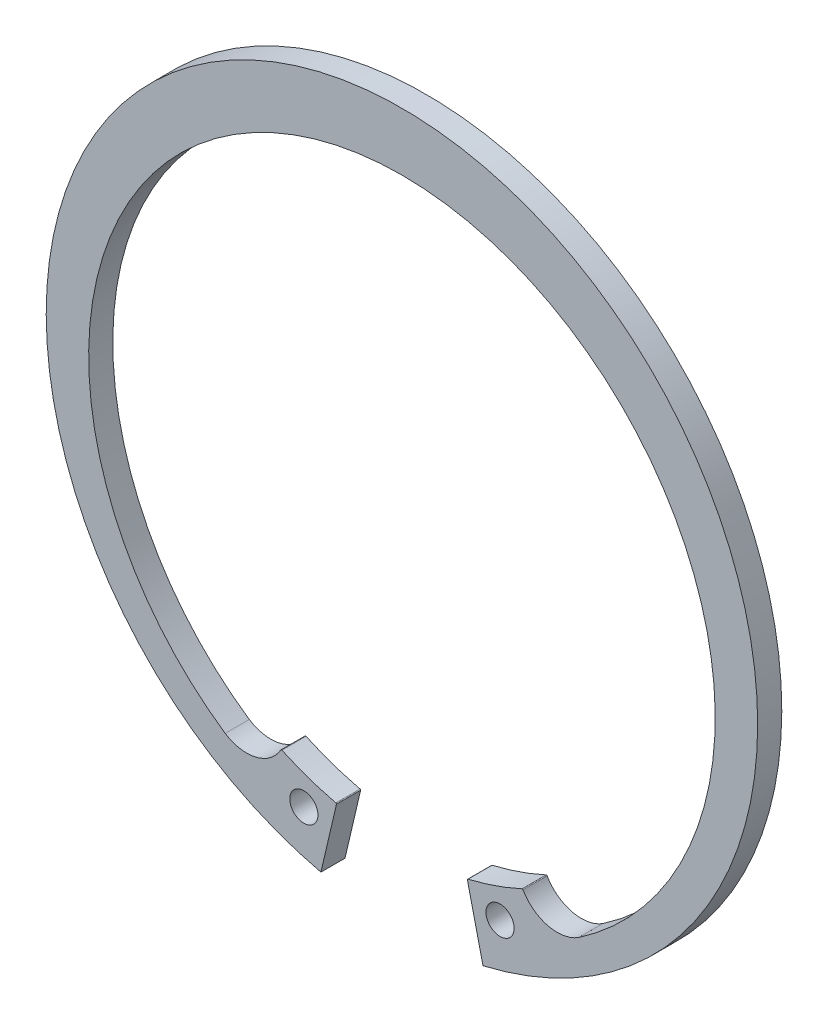
ISO-10303-21;
HEADER;
FILE_DESCRIPTION(('STEP AP214'),'2;1');
FILE_NAME('part.step','',(''),(''),'','','');
FILE_SCHEMA(('AUTOMOTIVE_DESIGN { 1 0 10303 214 1 1 1 1 }'));
ENDSEC;
DATA;
#1=APPLICATION_CONTEXT('core data for automotive mechanical design processes');
#2=APPLICATION_PROTOCOL_DEFINITION('international standard','automotive_design',2000,#1);
#3=PRODUCT_CONTEXT('',#1,'mechanical');
#4=PRODUCT('Part','Part','',(#3));
#5=PRODUCT_RELATED_PRODUCT_CATEGORY('part','',(#4));
#6=PRODUCT_DEFINITION_FORMATION('','',#4);
#7=PRODUCT_DEFINITION_CONTEXT('part definition',#1,'design');
#8=PRODUCT_DEFINITION('design','',#6,#7);
#9=PRODUCT_DEFINITION_SHAPE('','',#8);
#10=(LENGTH_UNIT() NAMED_UNIT(*) SI_UNIT(.MILLI.,.METRE.));
#11=(NAMED_UNIT(*) PLANE_ANGLE_UNIT() SI_UNIT($,.RADIAN.));
#12=(NAMED_UNIT(*) SI_UNIT($,.STERADIAN.) SOLID_ANGLE_UNIT());
#13=UNCERTAINTY_MEASURE_WITH_UNIT(LENGTH_MEASURE(1.E-05),#10,'distance_accuracy_value','');
#14=(GEOMETRIC_REPRESENTATION_CONTEXT(3) GLOBAL_UNCERTAINTY_ASSIGNED_CONTEXT((#13)) GLOBAL_UNIT_ASSIGNED_CONTEXT((#10,
#11,#12)) REPRESENTATION_CONTEXT('',''));
#15=CARTESIAN_POINT('',(0.,0.,0.));
#16=DIRECTION('',(0.,0.,1.));
#17=DIRECTION('',(1.,0.,0.));
#18=AXIS2_PLACEMENT_3D('',#15,#16,#17);
#19=CARTESIAN_POINT('',(0.,0.,-3.));
#20=DIRECTION('',(0.,0.,1.));
#21=DIRECTION('',(1.,0.,0.));
#22=AXIS2_PLACEMENT_3D('',#19,#20,#21);
#23=CYLINDRICAL_SURFACE('',#22,44.25);
#24=CARTESIAN_POINT('',(0.,0.,-3.));
#25=DIRECTION('',(0.,0.,1.));
#26=DIRECTION('',(1.,0.,0.));
#27=AXIS2_PLACEMENT_3D('',#24,#25,#26);
#28=CIRCLE('',#27,44.25);
#29=CARTESIAN_POINT('',(10.0815851585561,-43.0862407351904,-3.));
#30=VERTEX_POINT('',#29);
#31=CARTESIAN_POINT('',(-10.0815851585561,-43.0862407351904,-3.));
#32=VERTEX_POINT('',#31);
#33=EDGE_CURVE('E145',#30,#32,#28,.T.);
#34=ORIENTED_EDGE('',*,*,#33,.T.);
#35=DIRECTION('',(0.,0.,1.));
#36=VECTOR('',#35,1.);
#37=CARTESIAN_POINT('',(-10.0815851585561,-43.0862407351904,-3.));
#38=LINE('',#37,#36);
#39=CARTESIAN_POINT('',(-10.0815851585561,-43.0862407351904,0.));
#40=VERTEX_POINT('',#39);
#41=EDGE_CURVE('E35',#32,#40,#38,.T.);
#42=ORIENTED_EDGE('',*,*,#41,.T.);
#43=CARTESIAN_POINT('',(0.,0.,0.));
#44=DIRECTION('',(0.,0.,1.));
#45=DIRECTION('',(1.,0.,0.));
#46=AXIS2_PLACEMENT_3D('',#43,#44,#45);
#47=CIRCLE('',#46,44.25);
#48=CARTESIAN_POINT('',(10.0815851585561,-43.0862407351904,0.));
#49=VERTEX_POINT('',#48);
#50=EDGE_CURVE('E56',#49,#40,#47,.T.);
#51=ORIENTED_EDGE('',*,*,#50,.F.);
#52=DIRECTION('',(0.,0.,1.));
#53=VECTOR('',#52,1.);
#54=CARTESIAN_POINT('',(10.0815851585561,-43.0862407351904,-3.));
#55=LINE('',#54,#53);
#56=EDGE_CURVE('E11',#30,#49,#55,.T.);
#57=ORIENTED_EDGE('',*,*,#56,.F.);
#58=EDGE_LOOP('',(#34,#42,#51,#57));
#59=FACE_BOUND('',#58,.T.);
#60=ADVANCED_FACE('F32',(#59),#23,.T.);
#61=CARTESIAN_POINT('',(10.0815851585561,-43.0862407351904,-3.));
#62=DIRECTION('',(-0.973700355597523,-0.227832432961721,0.));
#63=DIRECTION('',(0.227832432961721,-0.973700355597523,0.));
#64=AXIS2_PLACEMENT_3D('',#61,#62,#63);
#65=PLANE('',#64);
#66=DIRECTION('',(0.227832432961721,-0.973700355597523,0.));
#67=VECTOR('',#66,1.);
#68=CARTESIAN_POINT('',(10.0815851585561,-43.0862407351904,0.));
#69=LINE('',#68,#67);
#70=CARTESIAN_POINT('',(8.14497761364325,-34.8096515304772,0.));
#71=VERTEX_POINT('',#70);
#72=EDGE_CURVE('E248',#71,#49,#69,.T.);
#73=ORIENTED_EDGE('',*,*,#72,.F.);
#74=DIRECTION('',(0.,0.,1.));
#75=VECTOR('',#74,1.);
#76=CARTESIAN_POINT('',(8.14497761364325,-34.8096515304772,-3.));
#77=LINE('',#76,#75);
#78=CARTESIAN_POINT('',(8.14497761364325,-34.8096515304772,-3.));
#79=VERTEX_POINT('',#78);
#80=EDGE_CURVE('E221',#79,#71,#77,.T.);
#81=ORIENTED_EDGE('',*,*,#80,.F.);
#82=DIRECTION('',(0.227832432961721,-0.973700355597523,0.));
#83=VECTOR('',#82,1.);
#84=CARTESIAN_POINT('',(10.0815851585561,-43.0862407351904,-3.));
#85=LINE('',#84,#83);
#86=EDGE_CURVE('E251',#79,#30,#85,.T.);
#87=ORIENTED_EDGE('',*,*,#86,.T.);
#88=ORIENTED_EDGE('',*,*,#56,.T.);
#89=EDGE_LOOP('',(#73,#81,#87,#88));
#90=FACE_BOUND('',#89,.T.);
#91=ADVANCED_FACE('F264',(#90),#65,.T.);
#92=CARTESIAN_POINT('',(0.,-1.9184583111504,-3.));
#93=DIRECTION('',(0.,0.,1.));
#94=DIRECTION('',(1.,0.,0.));
#95=AXIS2_PLACEMENT_3D('',#92,#93,#94);
#96=CYLINDRICAL_SURFACE('',#95,38.9684583111504);
#97=DIRECTION('',(0.,0.,1.));
#98=VECTOR('',#97,1.);
#99=CARTESIAN_POINT('',(-21.9854923683121,-34.0926540038286,-3.));
#100=LINE('',#99,#98);
#101=CARTESIAN_POINT('',(-21.9854923683121,-34.0926540038286,-3.));
#102=VERTEX_POINT('',#101);
#103=CARTESIAN_POINT('',(-21.9854923683121,-34.0926540038286,0.));
#104=VERTEX_POINT('',#103);
#105=EDGE_CURVE('E186',#102,#104,#100,.T.);
#106=ORIENTED_EDGE('',*,*,#105,.F.);
#107=CARTESIAN_POINT('',(0.,-1.9184583111504,-3.));
#108=DIRECTION('',(0.,0.,-1.));
#109=DIRECTION('',(1.,0.,0.));
#110=AXIS2_PLACEMENT_3D('',#107,#108,#109);
#111=CIRCLE('',#110,38.9684583111504);
#112=CARTESIAN_POINT('',(21.9854923683121,-34.0926540038286,-3.));
#113=VERTEX_POINT('',#112);
#114=EDGE_CURVE('E64',#102,#113,#111,.T.);
#115=ORIENTED_EDGE('',*,*,#114,.T.);
#116=DIRECTION('',(0.,0.,1.));
#117=VECTOR('',#116,1.);
#118=CARTESIAN_POINT('',(21.9854923683121,-34.0926540038286,-3.));
#119=LINE('',#118,#117);
#120=CARTESIAN_POINT('',(21.9854923683121,-34.0926540038286,0.));
#121=VERTEX_POINT('',#120);
#122=EDGE_CURVE('E224',#121,#113,#119,.F.);
#123=ORIENTED_EDGE('',*,*,#122,.F.);
#124=CARTESIAN_POINT('',(0.,-1.9184583111504,0.));
#125=DIRECTION('',(0.,0.,-1.));
#126=DIRECTION('',(1.,0.,0.));
#127=AXIS2_PLACEMENT_3D('',#124,#125,#126);
#128=CIRCLE('',#127,38.9684583111504);
#129=EDGE_CURVE('E257',#104,#121,#128,.T.);
#130=ORIENTED_EDGE('',*,*,#129,.F.);
#131=EDGE_LOOP('',(#106,#115,#123,#130));
#132=FACE_BOUND('',#131,.T.);
#133=ADVANCED_FACE('F286',(#132),#96,.F.);
#134=CARTESIAN_POINT('',(-10.0815851585561,-43.0862407351904,-3.));
#135=DIRECTION('',(0.973700355597523,-0.227832432961721,0.));
#136=DIRECTION('',(0.227832432961721,0.973700355597523,0.));
#137=AXIS2_PLACEMENT_3D('',#134,#135,#136);
#138=PLANE('',#137);
#139=DIRECTION('',(0.227832432961721,0.973700355597523,0.));
#140=VECTOR('',#139,1.);
#141=CARTESIAN_POINT('',(-10.0815851585561,-43.0862407351904,0.));
#142=LINE('',#141,#140);
#143=CARTESIAN_POINT('',(-8.14497761364324,-34.8096515304772,0.));
#144=VERTEX_POINT('',#143);
#145=EDGE_CURVE('E255',#40,#144,#142,.T.);
#146=ORIENTED_EDGE('',*,*,#145,.F.);
#147=ORIENTED_EDGE('',*,*,#41,.F.);
#148=DIRECTION('',(0.227832432961721,0.973700355597523,0.));
#149=VECTOR('',#148,1.);
#150=CARTESIAN_POINT('',(-10.0815851585561,-43.0862407351904,-3.));
#151=LINE('',#150,#149);
#152=CARTESIAN_POINT('',(-8.14497761364324,-34.8096515304772,-3.));
#153=VERTEX_POINT('',#152);
#154=EDGE_CURVE('E137',#32,#153,#151,.T.);
#155=ORIENTED_EDGE('',*,*,#154,.T.);
#156=DIRECTION('',(0.,0.,1.));
#157=VECTOR('',#156,1.);
#158=CARTESIAN_POINT('',(-8.14497761364324,-34.8096515304772,-3.));
#159=LINE('',#158,#157);
#160=EDGE_CURVE('E141',#153,#144,#159,.T.);
#161=ORIENTED_EDGE('',*,*,#160,.T.);
#162=EDGE_LOOP('',(#146,#147,#155,#161));
#163=FACE_BOUND('',#162,.T.);
#164=ADVANCED_FACE('F140',(#163),#138,.T.);
#165=CARTESIAN_POINT('',(0.,0.,-3.));
#166=DIRECTION('',(0.,0.,1.));
#167=DIRECTION('',(1.,0.,0.));
#168=AXIS2_PLACEMENT_3D('',#165,#166,#167);
#169=PLANE('',#168);
#170=ORIENTED_EDGE('',*,*,#114,.F.);
#171=DIRECTION('',(-0.541956834096612,-0.840406324331259,0.));
#172=VECTOR('',#171,1.);
#173=CARTESIAN_POINT('',(-23.9815899087751,-37.1879798516582,-3.));
#174=LINE('',#173,#172);
#175=CARTESIAN_POINT('',(-21.9844067641948,-34.0909705698196,-3.));
#176=VERTEX_POINT('',#175);
#177=EDGE_CURVE('E155',#176,#102,#174,.T.);
#178=ORIENTED_EDGE('',*,*,#177,.F.);
#179=CARTESIAN_POINT('',(-19.3207611355442,-29.9604854624094,-3.));
#180=DIRECTION('',(0.,0.,-1.));
#181=DIRECTION('',(1.,0.,0.));
#182=AXIS2_PLACEMENT_3D('',#179,#180,#181);
#183=CIRCLE('',#182,4.91486675888232);
#184=CARTESIAN_POINT('',(-15.0613610013079,-32.4127141944068,-3.));
#185=VERTEX_POINT('',#184);
#186=EDGE_CURVE('E172',#185,#176,#183,.T.);
#187=ORIENTED_EDGE('',*,*,#186,.F.);
#188=CARTESIAN_POINT('',(-14.9746974081079,-32.462608298404,-3.));
#189=DIRECTION('',(0.,0.,1.));
#190=DIRECTION('',(1.,0.,0.));
#191=AXIS2_PLACEMENT_3D('',#188,#189,#190);
#192=CIRCLE('',#191,0.100000000000009);
#193=CARTESIAN_POINT('',(-14.9328101426307,-32.3718037996672,-3.));
#194=VERTEX_POINT('',#193);
#195=EDGE_CURVE('E164',#194,#185,#192,.T.);
#196=ORIENTED_EDGE('',*,*,#195,.F.);
#197=CARTESIAN_POINT('',(0.,0.,-3.));
#198=DIRECTION('',(0.,0.,-1.));
#199=DIRECTION('',(1.,0.,0.));
#200=AXIS2_PLACEMENT_3D('',#197,#198,#199);
#201=CIRCLE('',#200,35.65);
#202=CARTESIAN_POINT('',(-8.21929213130313,-34.6895623619021,-3.));
#203=VERTEX_POINT('',#202);
#204=EDGE_CURVE('E160',#203,#194,#201,.T.);
#205=ORIENTED_EDGE('',*,*,#204,.F.);
#206=CARTESIAN_POINT('',(-8.242347649203,-34.786868287181,-3.));
#207=DIRECTION('',(0.,0.,1.));
#208=DIRECTION('',(-1.,0.,0.));
#209=AXIS2_PLACEMENT_3D('',#206,#207,#208);
#210=CIRCLE('',#209,0.1);
#211=EDGE_CURVE('E151',#153,#203,#210,.T.);
#212=ORIENTED_EDGE('',*,*,#211,.F.);
#213=ORIENTED_EDGE('',*,*,#154,.F.);
#214=ORIENTED_EDGE('',*,*,#33,.F.);
#215=ORIENTED_EDGE('',*,*,#86,.F.);
#216=CARTESIAN_POINT('',(8.24234764920299,-34.786868287181,-3.));
#217=DIRECTION('',(0.,0.,1.));
#218=DIRECTION('',(1.,0.,0.));
#219=AXIS2_PLACEMENT_3D('',#216,#217,#218);
#220=CIRCLE('',#219,0.0999999999999956);
#221=CARTESIAN_POINT('',(8.21929213130313,-34.6895623619022,-3.));
#222=VERTEX_POINT('',#221);
#223=EDGE_CURVE('E206',#222,#79,#220,.T.);
#224=ORIENTED_EDGE('',*,*,#223,.F.);
#225=CARTESIAN_POINT('',(0.,0.,-3.));
#226=DIRECTION('',(0.,0.,-1.));
#227=DIRECTION('',(1.,0.,0.));
#228=AXIS2_PLACEMENT_3D('',#225,#226,#227);
#229=CIRCLE('',#228,35.65);
#230=CARTESIAN_POINT('',(14.9328101426307,-32.3718037996672,-3.));
#231=VERTEX_POINT('',#230);
#232=EDGE_CURVE('E204',#231,#222,#229,.T.);
#233=ORIENTED_EDGE('',*,*,#232,.F.);
#234=CARTESIAN_POINT('',(14.9746974081079,-32.462608298404,-3.));
#235=DIRECTION('',(0.,0.,1.));
#236=DIRECTION('',(-1.,0.,0.));
#237=AXIS2_PLACEMENT_3D('',#234,#235,#236);
#238=CIRCLE('',#237,0.100000000000009);
#239=CARTESIAN_POINT('',(15.0613610013079,-32.4127141944068,-3.));
#240=VERTEX_POINT('',#239);
#241=EDGE_CURVE('E201',#240,#231,#238,.T.);
#242=ORIENTED_EDGE('',*,*,#241,.F.);
#243=CARTESIAN_POINT('',(19.3207611355442,-29.9604854624094,-3.));
#244=DIRECTION('',(0.,0.,-1.));
#245=DIRECTION('',(1.,0.,0.));
#246=AXIS2_PLACEMENT_3D('',#243,#244,#245);
#247=CIRCLE('',#246,4.91486675888232);
#248=CARTESIAN_POINT('',(21.9844067641948,-34.0909705698196,-3.));
#249=VERTEX_POINT('',#248);
#250=EDGE_CURVE('E197',#249,#240,#247,.T.);
#251=ORIENTED_EDGE('',*,*,#250,.F.);
#252=DIRECTION('',(-0.541956834096613,0.840406324331258,0.));
#253=VECTOR('',#252,1.);
#254=CARTESIAN_POINT('',(21.9844067641948,-34.0909705698196,-3.));
#255=LINE('',#254,#253);
#256=EDGE_CURVE('E195',#113,#249,#255,.T.);
#257=ORIENTED_EDGE('',*,*,#256,.F.);
#258=EDGE_LOOP('',(#170,#178,#187,#196,#205,#212,#213,#214,#215,#224,#233,#242,#251,#257));
#259=FACE_BOUND('',#258,.T.);
#260=CARTESIAN_POINT('',(12.2032115447071,-37.120577217968,-3.));
#261=DIRECTION('',(0.,0.,1.));
#262=DIRECTION('',(1.,0.,0.));
#263=AXIS2_PLACEMENT_3D('',#260,#261,#262);
#264=CIRCLE('',#263,1.75);
#265=CARTESIAN_POINT('',(13.9532115447071,-37.120577217968,-3.));
#266=VERTEX_POINT('',#265);
#267=EDGE_CURVE('E243',#266,#266,#264,.T.);
#268=ORIENTED_EDGE('',*,*,#267,.T.);
#269=EDGE_LOOP('',(#268));
#270=FACE_BOUND('',#269,.T.);
#271=CARTESIAN_POINT('',(-12.2032115447071,-37.120577217968,-3.));
#272=DIRECTION('',(0.,0.,1.));
#273=DIRECTION('',(1.,0.,0.));
#274=AXIS2_PLACEMENT_3D('',#271,#272,#273);
#275=CIRCLE('',#274,1.75);
#276=CARTESIAN_POINT('',(-10.4532115447071,-37.120577217968,-3.));
#277=VERTEX_POINT('',#276);
#278=EDGE_CURVE('E237',#277,#277,#275,.T.);
#279=ORIENTED_EDGE('',*,*,#278,.T.);
#280=EDGE_LOOP('',(#279));
#281=FACE_BOUND('',#280,.T.);
#282=ADVANCED_FACE('F157',(#259,#270,#281),#169,.F.);
#283=CARTESIAN_POINT('',(0.,0.,0.));
#284=DIRECTION('',(0.,0.,1.));
#285=DIRECTION('',(1.,0.,0.));
#286=AXIS2_PLACEMENT_3D('',#283,#284,#285);
#287=PLANE('',#286);
#288=DIRECTION('',(-0.541956834096612,-0.840406324331259,0.));
#289=VECTOR('',#288,1.);
#290=CARTESIAN_POINT('',(-23.9815899087751,-37.1879798516582,0.));
#291=LINE('',#290,#289);
#292=CARTESIAN_POINT('',(-21.9844067641948,-34.0909705698196,0.));
#293=VERTEX_POINT('',#292);
#294=EDGE_CURVE('E162',#293,#104,#291,.T.);
#295=ORIENTED_EDGE('',*,*,#294,.T.);
#296=ORIENTED_EDGE('',*,*,#129,.T.);
#297=DIRECTION('',(-0.541956834096613,0.840406324331258,0.));
#298=VECTOR('',#297,1.);
#299=CARTESIAN_POINT('',(21.9844067641948,-34.0909705698196,0.));
#300=LINE('',#299,#298);
#301=CARTESIAN_POINT('',(21.9844067641948,-34.0909705698196,0.));
#302=VERTEX_POINT('',#301);
#303=EDGE_CURVE('E194',#121,#302,#300,.T.);
#304=ORIENTED_EDGE('',*,*,#303,.T.);
#305=CARTESIAN_POINT('',(19.3207611355442,-29.9604854624094,0.));
#306=DIRECTION('',(0.,0.,-1.));
#307=DIRECTION('',(1.,0.,0.));
#308=AXIS2_PLACEMENT_3D('',#305,#306,#307);
#309=CIRCLE('',#308,4.91486675888232);
#310=CARTESIAN_POINT('',(15.0613610013079,-32.4127141944068,0.));
#311=VERTEX_POINT('',#310);
#312=EDGE_CURVE('E211',#302,#311,#309,.T.);
#313=ORIENTED_EDGE('',*,*,#312,.T.);
#314=CARTESIAN_POINT('',(14.9746974081079,-32.462608298404,0.));
#315=DIRECTION('',(0.,0.,1.));
#316=DIRECTION('',(-1.,0.,0.));
#317=AXIS2_PLACEMENT_3D('',#314,#315,#316);
#318=CIRCLE('',#317,0.100000000000009);
#319=CARTESIAN_POINT('',(14.9328101426307,-32.3718037996672,0.));
#320=VERTEX_POINT('',#319);
#321=EDGE_CURVE('E214',#311,#320,#318,.T.);
#322=ORIENTED_EDGE('',*,*,#321,.T.);
#323=CARTESIAN_POINT('',(0.,0.,0.));
#324=DIRECTION('',(0.,0.,-1.));
#325=DIRECTION('',(1.,0.,0.));
#326=AXIS2_PLACEMENT_3D('',#323,#324,#325);
#327=CIRCLE('',#326,35.65);
#328=CARTESIAN_POINT('',(8.21929213130313,-34.6895623619022,0.));
#329=VERTEX_POINT('',#328);
#330=EDGE_CURVE('E217',#320,#329,#327,.T.);
#331=ORIENTED_EDGE('',*,*,#330,.T.);
#332=CARTESIAN_POINT('',(8.24234764920299,-34.786868287181,0.));
#333=DIRECTION('',(0.,0.,1.));
#334=DIRECTION('',(1.,0.,0.));
#335=AXIS2_PLACEMENT_3D('',#332,#333,#334);
#336=CIRCLE('',#335,0.0999999999999956);
#337=EDGE_CURVE('E198',#329,#71,#336,.T.);
#338=ORIENTED_EDGE('',*,*,#337,.T.);
#339=ORIENTED_EDGE('',*,*,#72,.T.);
#340=ORIENTED_EDGE('',*,*,#50,.T.);
#341=ORIENTED_EDGE('',*,*,#145,.T.);
#342=CARTESIAN_POINT('',(-8.242347649203,-34.786868287181,0.));
#343=DIRECTION('',(0.,0.,1.));
#344=DIRECTION('',(-1.,0.,0.));
#345=AXIS2_PLACEMENT_3D('',#342,#343,#344);
#346=CIRCLE('',#345,0.1);
#347=CARTESIAN_POINT('',(-8.21929213130313,-34.6895623619021,0.));
#348=VERTEX_POINT('',#347);
#349=EDGE_CURVE('E153',#144,#348,#346,.T.);
#350=ORIENTED_EDGE('',*,*,#349,.T.);
#351=CARTESIAN_POINT('',(0.,0.,0.));
#352=DIRECTION('',(0.,0.,-1.));
#353=DIRECTION('',(1.,0.,0.));
#354=AXIS2_PLACEMENT_3D('',#351,#352,#353);
#355=CIRCLE('',#354,35.65);
#356=CARTESIAN_POINT('',(-14.9328101426307,-32.3718037996672,0.));
#357=VERTEX_POINT('',#356);
#358=EDGE_CURVE('E177',#348,#357,#355,.T.);
#359=ORIENTED_EDGE('',*,*,#358,.T.);
#360=CARTESIAN_POINT('',(-14.9746974081079,-32.462608298404,0.));
#361=DIRECTION('',(0.,0.,1.));
#362=DIRECTION('',(1.,0.,0.));
#363=AXIS2_PLACEMENT_3D('',#360,#361,#362);
#364=CIRCLE('',#363,0.100000000000009);
#365=CARTESIAN_POINT('',(-15.0613610013079,-32.4127141944068,0.));
#366=VERTEX_POINT('',#365);
#367=EDGE_CURVE('E179',#357,#366,#364,.T.);
#368=ORIENTED_EDGE('',*,*,#367,.T.);
#369=CARTESIAN_POINT('',(-19.3207611355442,-29.9604854624094,0.));
#370=DIRECTION('',(0.,0.,-1.));
#371=DIRECTION('',(1.,0.,0.));
#372=AXIS2_PLACEMENT_3D('',#369,#370,#371);
#373=CIRCLE('',#372,4.91486675888232);
#374=EDGE_CURVE('E167',#366,#293,#373,.T.);
#375=ORIENTED_EDGE('',*,*,#374,.T.);
#376=EDGE_LOOP('',(#295,#296,#304,#313,#322,#331,#338,#339,#340,#341,#350,#359,#368,#375));
#377=FACE_BOUND('',#376,.T.);
#378=CARTESIAN_POINT('',(12.2032115447071,-37.120577217968,0.));
#379=DIRECTION('',(0.,0.,1.));
#380=DIRECTION('',(1.,0.,0.));
#381=AXIS2_PLACEMENT_3D('',#378,#379,#380);
#382=CIRCLE('',#381,1.75);
#383=CARTESIAN_POINT('',(13.9532115447071,-37.120577217968,0.));
#384=VERTEX_POINT('',#383);
#385=EDGE_CURVE('E240',#384,#384,#382,.T.);
#386=ORIENTED_EDGE('',*,*,#385,.F.);
#387=EDGE_LOOP('',(#386));
#388=FACE_BOUND('',#387,.T.);
#389=CARTESIAN_POINT('',(-12.2032115447071,-37.120577217968,0.));
#390=DIRECTION('',(0.,0.,1.));
#391=DIRECTION('',(1.,0.,0.));
#392=AXIS2_PLACEMENT_3D('',#389,#390,#391);
#393=CIRCLE('',#392,1.75);
#394=CARTESIAN_POINT('',(-10.4532115447071,-37.120577217968,0.));
#395=VERTEX_POINT('',#394);
#396=EDGE_CURVE('E236',#395,#395,#393,.T.);
#397=ORIENTED_EDGE('',*,*,#396,.F.);
#398=EDGE_LOOP('',(#397));
#399=FACE_BOUND('',#398,.T.);
#400=ADVANCED_FACE('F259',(#377,#388,#399),#287,.T.);
#401=CARTESIAN_POINT('',(12.2032115447071,-37.120577217968,-3.));
#402=DIRECTION('',(0.,0.,1.));
#403=DIRECTION('',(1.,0.,0.));
#404=AXIS2_PLACEMENT_3D('',#401,#402,#403);
#405=CYLINDRICAL_SURFACE('',#404,1.75);
#406=ORIENTED_EDGE('',*,*,#267,.F.);
#407=EDGE_LOOP('',(#406));
#408=FACE_BOUND('',#407,.T.);
#409=ORIENTED_EDGE('',*,*,#385,.T.);
#410=EDGE_LOOP('',(#409));
#411=FACE_BOUND('',#410,.T.);
#412=ADVANCED_FACE('F309',(#408,#411),#405,.F.);
#413=CARTESIAN_POINT('',(-12.2032115447071,-37.120577217968,-3.));
#414=DIRECTION('',(0.,0.,1.));
#415=DIRECTION('',(1.,0.,0.));
#416=AXIS2_PLACEMENT_3D('',#413,#414,#415);
#417=CYLINDRICAL_SURFACE('',#416,1.75);
#418=ORIENTED_EDGE('',*,*,#278,.F.);
#419=EDGE_LOOP('',(#418));
#420=FACE_BOUND('',#419,.T.);
#421=ORIENTED_EDGE('',*,*,#396,.T.);
#422=EDGE_LOOP('',(#421));
#423=FACE_BOUND('',#422,.T.);
#424=ADVANCED_FACE('F302',(#420,#423),#417,.F.);
#425=CARTESIAN_POINT('',(0.,0.,-3.));
#426=DIRECTION('',(0.,0.,1.));
#427=DIRECTION('',(1.,0.,0.));
#428=AXIS2_PLACEMENT_3D('',#425,#426,#427);
#429=CYLINDRICAL_SURFACE('',#428,35.65);
#430=ORIENTED_EDGE('',*,*,#330,.F.);
#431=DIRECTION('',(0.,0.,1.));
#432=VECTOR('',#431,1.);
#433=CARTESIAN_POINT('',(14.9328101426307,-32.3718037996672,-3.));
#434=LINE('',#433,#432);
#435=EDGE_CURVE('E228',#231,#320,#434,.T.);
#436=ORIENTED_EDGE('',*,*,#435,.F.);
#437=ORIENTED_EDGE('',*,*,#232,.T.);
#438=DIRECTION('',(0.,0.,1.));
#439=VECTOR('',#438,1.);
#440=CARTESIAN_POINT('',(8.21929213130313,-34.6895623619022,-3.));
#441=LINE('',#440,#439);
#442=EDGE_CURVE('E225',#222,#329,#441,.T.);
#443=ORIENTED_EDGE('',*,*,#442,.T.);
#444=EDGE_LOOP('',(#430,#436,#437,#443));
#445=FACE_BOUND('',#444,.T.);
#446=ADVANCED_FACE('F300',(#445),#429,.F.);
#447=CARTESIAN_POINT('',(8.24234764920299,-34.786868287181,-3.));
#448=DIRECTION('',(0.,0.,1.));
#449=DIRECTION('',(1.,0.,0.));
#450=AXIS2_PLACEMENT_3D('',#447,#448,#449);
#451=CYLINDRICAL_SURFACE('',#450,0.0999999999999956);
#452=ORIENTED_EDGE('',*,*,#337,.F.);
#453=ORIENTED_EDGE('',*,*,#442,.F.);
#454=ORIENTED_EDGE('',*,*,#223,.T.);
#455=ORIENTED_EDGE('',*,*,#80,.T.);
#456=EDGE_LOOP('',(#452,#453,#454,#455));
#457=FACE_BOUND('',#456,.T.);
#458=ADVANCED_FACE('F266',(#457),#451,.T.);
#459=CARTESIAN_POINT('',(14.9746974081079,-32.462608298404,-3.));
#460=DIRECTION('',(0.,0.,1.));
#461=DIRECTION('',(1.,0.,0.));
#462=AXIS2_PLACEMENT_3D('',#459,#460,#461);
#463=CYLINDRICAL_SURFACE('',#462,0.100000000000009);
#464=ORIENTED_EDGE('',*,*,#321,.F.);
#465=DIRECTION('',(0.,0.,1.));
#466=VECTOR('',#465,1.);
#467=CARTESIAN_POINT('',(15.0613610013079,-32.4127141944068,-3.));
#468=LINE('',#467,#466);
#469=EDGE_CURVE('E231',#240,#311,#468,.T.);
#470=ORIENTED_EDGE('',*,*,#469,.F.);
#471=ORIENTED_EDGE('',*,*,#241,.T.);
#472=ORIENTED_EDGE('',*,*,#435,.T.);
#473=EDGE_LOOP('',(#464,#470,#471,#472));
#474=FACE_BOUND('',#473,.T.);
#475=ADVANCED_FACE('F298',(#474),#463,.T.);
#476=CARTESIAN_POINT('',(19.3207611355442,-29.9604854624094,-3.));
#477=DIRECTION('',(0.,0.,1.));
#478=DIRECTION('',(1.,0.,0.));
#479=AXIS2_PLACEMENT_3D('',#476,#477,#478);
#480=CYLINDRICAL_SURFACE('',#479,4.91486675888232);
#481=ORIENTED_EDGE('',*,*,#312,.F.);
#482=DIRECTION('',(0.,0.,1.));
#483=VECTOR('',#482,1.);
#484=CARTESIAN_POINT('',(21.9844067641948,-34.0909705698196,-3.));
#485=LINE('',#484,#483);
#486=EDGE_CURVE('E209',#249,#302,#485,.T.);
#487=ORIENTED_EDGE('',*,*,#486,.F.);
#488=ORIENTED_EDGE('',*,*,#250,.T.);
#489=ORIENTED_EDGE('',*,*,#469,.T.);
#490=EDGE_LOOP('',(#481,#487,#488,#489));
#491=FACE_BOUND('',#490,.T.);
#492=ADVANCED_FACE('F295',(#491),#480,.F.);
#493=CARTESIAN_POINT('',(21.9844067641948,-34.0909705698196,-3.));
#494=DIRECTION('',(0.840406324331258,0.541956834096613,0.));
#495=DIRECTION('',(-0.541956834096613,0.840406324331258,0.));
#496=AXIS2_PLACEMENT_3D('',#493,#494,#495);
#497=PLANE('',#496);
#498=ORIENTED_EDGE('',*,*,#303,.F.);
#499=ORIENTED_EDGE('',*,*,#122,.T.);
#500=ORIENTED_EDGE('',*,*,#256,.T.);
#501=ORIENTED_EDGE('',*,*,#486,.T.);
#502=EDGE_LOOP('',(#498,#499,#500,#501));
#503=FACE_BOUND('',#502,.T.);
#504=ADVANCED_FACE('F292',(#503),#497,.T.);
#505=CARTESIAN_POINT('',(0.,0.,-3.));
#506=DIRECTION('',(0.,0.,1.));
#507=DIRECTION('',(1.,0.,0.));
#508=AXIS2_PLACEMENT_3D('',#505,#506,#507);
#509=CYLINDRICAL_SURFACE('',#508,35.65);
#510=ORIENTED_EDGE('',*,*,#358,.F.);
#511=DIRECTION('',(0.,0.,1.));
#512=VECTOR('',#511,1.);
#513=CARTESIAN_POINT('',(-8.21929213130313,-34.6895623619021,-3.));
#514=LINE('',#513,#512);
#515=EDGE_CURVE('E154',#203,#348,#514,.T.);
#516=ORIENTED_EDGE('',*,*,#515,.F.);
#517=ORIENTED_EDGE('',*,*,#204,.T.);
#518=DIRECTION('',(0.,0.,1.));
#519=VECTOR('',#518,1.);
#520=CARTESIAN_POINT('',(-14.9328101426307,-32.3718037996672,-3.));
#521=LINE('',#520,#519);
#522=EDGE_CURVE('E189',#194,#357,#521,.T.);
#523=ORIENTED_EDGE('',*,*,#522,.T.);
#524=EDGE_LOOP('',(#510,#516,#517,#523));
#525=FACE_BOUND('',#524,.T.);
#526=ADVANCED_FACE('F274',(#525),#509,.F.);
#527=CARTESIAN_POINT('',(-23.9815899087751,-37.1879798516582,-3.));
#528=DIRECTION('',(-0.840406324331259,0.541956834096612,0.));
#529=DIRECTION('',(-0.541956834096612,-0.840406324331259,0.));
#530=AXIS2_PLACEMENT_3D('',#527,#528,#529);
#531=PLANE('',#530);
#532=ORIENTED_EDGE('',*,*,#177,.T.);
#533=ORIENTED_EDGE('',*,*,#105,.T.);
#534=ORIENTED_EDGE('',*,*,#294,.F.);
#535=DIRECTION('',(0.,0.,1.));
#536=VECTOR('',#535,1.);
#537=CARTESIAN_POINT('',(-21.9844067641948,-34.0909705698196,-3.));
#538=LINE('',#537,#536);
#539=EDGE_CURVE('E184',#176,#293,#538,.T.);
#540=ORIENTED_EDGE('',*,*,#539,.F.);
#541=EDGE_LOOP('',(#532,#533,#534,#540));
#542=FACE_BOUND('',#541,.T.);
#543=ADVANCED_FACE('F284',(#542),#531,.T.);
#544=CARTESIAN_POINT('',(-19.3207611355442,-29.9604854624094,-3.));
#545=DIRECTION('',(0.,0.,1.));
#546=DIRECTION('',(1.,0.,0.));
#547=AXIS2_PLACEMENT_3D('',#544,#545,#546);
#548=CYLINDRICAL_SURFACE('',#547,4.91486675888232);
#549=ORIENTED_EDGE('',*,*,#374,.F.);
#550=DIRECTION('',(0.,0.,1.));
#551=VECTOR('',#550,1.);
#552=CARTESIAN_POINT('',(-15.0613610013079,-32.4127141944068,-3.));
#553=LINE('',#552,#551);
#554=EDGE_CURVE('E187',#185,#366,#553,.T.);
#555=ORIENTED_EDGE('',*,*,#554,.F.);
#556=ORIENTED_EDGE('',*,*,#186,.T.);
#557=ORIENTED_EDGE('',*,*,#539,.T.);
#558=EDGE_LOOP('',(#549,#555,#556,#557));
#559=FACE_BOUND('',#558,.T.);
#560=ADVANCED_FACE('F280',(#559),#548,.F.);
#561=CARTESIAN_POINT('',(-14.9746974081079,-32.462608298404,-3.));
#562=DIRECTION('',(0.,0.,1.));
#563=DIRECTION('',(1.,0.,0.));
#564=AXIS2_PLACEMENT_3D('',#561,#562,#563);
#565=CYLINDRICAL_SURFACE('',#564,0.100000000000009);
#566=ORIENTED_EDGE('',*,*,#367,.F.);
#567=ORIENTED_EDGE('',*,*,#522,.F.);
#568=ORIENTED_EDGE('',*,*,#195,.T.);
#569=ORIENTED_EDGE('',*,*,#554,.T.);
#570=EDGE_LOOP('',(#566,#567,#568,#569));
#571=FACE_BOUND('',#570,.T.);
#572=ADVANCED_FACE('F276',(#571),#565,.T.);
#573=CARTESIAN_POINT('',(-8.242347649203,-34.786868287181,-3.));
#574=DIRECTION('',(0.,0.,1.));
#575=DIRECTION('',(1.,0.,0.));
#576=AXIS2_PLACEMENT_3D('',#573,#574,#575);
#577=CYLINDRICAL_SURFACE('',#576,0.1);
#578=ORIENTED_EDGE('',*,*,#349,.F.);
#579=ORIENTED_EDGE('',*,*,#160,.F.);
#580=ORIENTED_EDGE('',*,*,#211,.T.);
#581=ORIENTED_EDGE('',*,*,#515,.T.);
#582=EDGE_LOOP('',(#578,#579,#580,#581));
#583=FACE_BOUND('',#582,.T.);
#584=ADVANCED_FACE('F149',(#583),#577,.T.);
#585=CLOSED_SHELL('',(#60,#91,#133,#164,#282,#400,#412,#424,#446,#458,#475,#492,#504,#526,#543,
#560,#572,#584));
#586=MANIFOLD_SOLID_BREP('B2',#585);
#587=ADVANCED_BREP_SHAPE_REPRESENTATION('',(#18,#586),#14);
#588=SHAPE_DEFINITION_REPRESENTATION(#9,#587);
ENDSEC;
END-ISO-10303-21;
